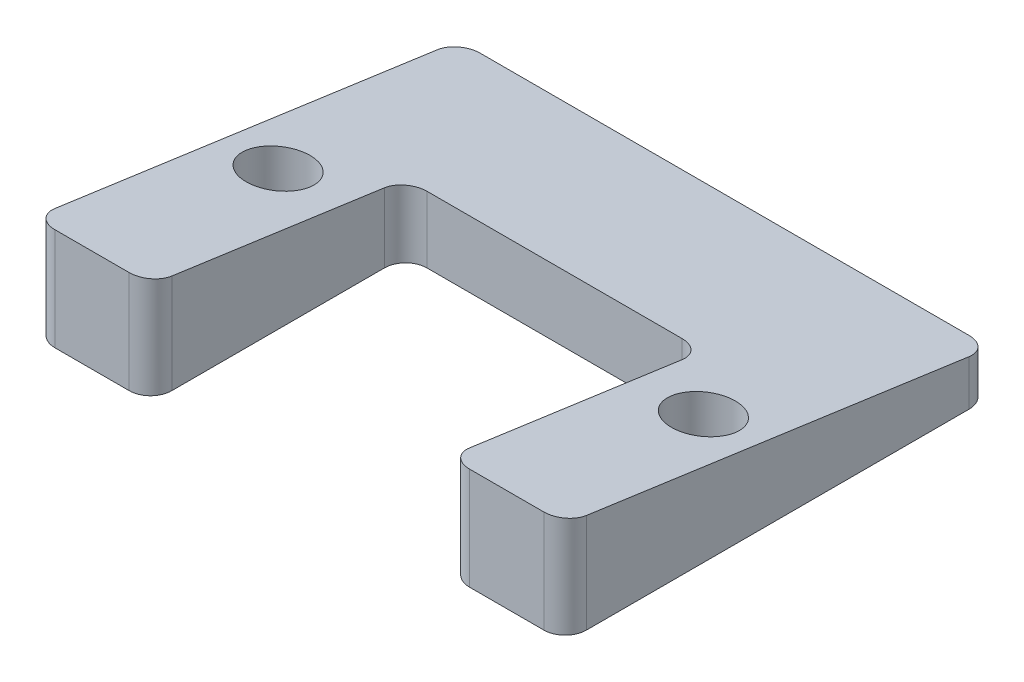
ISO-10303-21;
HEADER;
FILE_DESCRIPTION(('STEP AP214'),'2;1');
FILE_NAME('part.step','',(''),(''),'','','');
FILE_SCHEMA(('AUTOMOTIVE_DESIGN { 1 0 10303 214 1 1 1 1 }'));
ENDSEC;
DATA;
#1=APPLICATION_CONTEXT('core data for automotive mechanical design processes');
#2=APPLICATION_PROTOCOL_DEFINITION('international standard','automotive_design',2000,#1);
#3=PRODUCT_CONTEXT('',#1,'mechanical');
#4=PRODUCT('Part','Part','',(#3));
#5=PRODUCT_RELATED_PRODUCT_CATEGORY('part','',(#4));
#6=PRODUCT_DEFINITION_FORMATION('','',#4);
#7=PRODUCT_DEFINITION_CONTEXT('part definition',#1,'design');
#8=PRODUCT_DEFINITION('design','',#6,#7);
#9=PRODUCT_DEFINITION_SHAPE('','',#8);
#10=(LENGTH_UNIT() NAMED_UNIT(*) SI_UNIT(.MILLI.,.METRE.));
#11=(NAMED_UNIT(*) PLANE_ANGLE_UNIT() SI_UNIT($,.RADIAN.));
#12=(NAMED_UNIT(*) SI_UNIT($,.STERADIAN.) SOLID_ANGLE_UNIT());
#13=UNCERTAINTY_MEASURE_WITH_UNIT(LENGTH_MEASURE(1.E-05),#10,'distance_accuracy_value','');
#14=(GEOMETRIC_REPRESENTATION_CONTEXT(3) GLOBAL_UNCERTAINTY_ASSIGNED_CONTEXT((#13)) GLOBAL_UNIT_ASSIGNED_CONTEXT((#10,
#11,#12)) REPRESENTATION_CONTEXT('',''));
#15=CARTESIAN_POINT('',(0.,0.,0.));
#16=DIRECTION('',(0.,0.,1.));
#17=DIRECTION('',(1.,0.,0.));
#18=AXIS2_PLACEMENT_3D('',#15,#16,#17);
#19=CARTESIAN_POINT('',(0.,0.,0.));
#20=DIRECTION('',(0.,1.,0.));
#21=DIRECTION('',(0.,0.,1.));
#22=AXIS2_PLACEMENT_3D('',#19,#20,#21);
#23=PLANE('',#22);
#24=DIRECTION('',(-1.,0.,0.));
#25=VECTOR('',#24,1.);
#26=CARTESIAN_POINT('',(12.5,0.,-11.));
#27=LINE('',#26,#25);
#28=CARTESIAN_POINT('',(11.5,0.,-11.));
#29=VERTEX_POINT('',#28);
#30=CARTESIAN_POINT('',(-11.5,0.,-11.));
#31=VERTEX_POINT('',#30);
#32=EDGE_CURVE('E174',#29,#31,#27,.T.);
#33=ORIENTED_EDGE('',*,*,#32,.F.);
#34=CARTESIAN_POINT('',(11.5,0.,-10.));
#35=DIRECTION('',(0.,1.,0.));
#36=DIRECTION('',(0.,0.,1.));
#37=AXIS2_PLACEMENT_3D('',#34,#35,#36);
#38=CIRCLE('',#37,1.);
#39=CARTESIAN_POINT('',(12.5,0.,-10.));
#40=VERTEX_POINT('',#39);
#41=EDGE_CURVE('E245',#29,#40,#38,.F.);
#42=ORIENTED_EDGE('',*,*,#41,.T.);
#43=DIRECTION('',(0.,0.,-1.));
#44=VECTOR('',#43,1.);
#45=CARTESIAN_POINT('',(12.5,0.,9.));
#46=LINE('',#45,#44);
#47=CARTESIAN_POINT('',(12.5,0.,8.));
#48=VERTEX_POINT('',#47);
#49=EDGE_CURVE('E230',#48,#40,#46,.T.);
#50=ORIENTED_EDGE('',*,*,#49,.F.);
#51=CARTESIAN_POINT('',(11.5,0.,8.));
#52=DIRECTION('',(0.,1.,0.));
#53=DIRECTION('',(0.,0.,1.));
#54=AXIS2_PLACEMENT_3D('',#51,#52,#53);
#55=CIRCLE('',#54,1.);
#56=CARTESIAN_POINT('',(11.5,0.,9.));
#57=VERTEX_POINT('',#56);
#58=EDGE_CURVE('E243',#48,#57,#55,.F.);
#59=ORIENTED_EDGE('',*,*,#58,.T.);
#60=DIRECTION('',(1.,0.,0.));
#61=VECTOR('',#60,1.);
#62=CARTESIAN_POINT('',(7.,0.,9.));
#63=LINE('',#62,#61);
#64=CARTESIAN_POINT('',(8.,0.,9.));
#65=VERTEX_POINT('',#64);
#66=EDGE_CURVE('E227',#65,#57,#63,.T.);
#67=ORIENTED_EDGE('',*,*,#66,.F.);
#68=CARTESIAN_POINT('',(8.,0.,8.));
#69=DIRECTION('',(0.,1.,0.));
#70=DIRECTION('',(0.,0.,1.));
#71=AXIS2_PLACEMENT_3D('',#68,#69,#70);
#72=CIRCLE('',#71,1.);
#73=CARTESIAN_POINT('',(7.,0.,8.));
#74=VERTEX_POINT('',#73);
#75=EDGE_CURVE('E241',#65,#74,#72,.F.);
#76=ORIENTED_EDGE('',*,*,#75,.T.);
#77=DIRECTION('',(0.,0.,1.));
#78=VECTOR('',#77,1.);
#79=CARTESIAN_POINT('',(7.,0.,9.));
#80=LINE('',#79,#78);
#81=CARTESIAN_POINT('',(7.,0.,-2.));
#82=VERTEX_POINT('',#81);
#83=EDGE_CURVE('E225',#82,#74,#80,.T.);
#84=ORIENTED_EDGE('',*,*,#83,.F.);
#85=CARTESIAN_POINT('',(6.,0.,-2.));
#86=DIRECTION('',(0.,1.,0.));
#87=DIRECTION('',(0.,0.,1.));
#88=AXIS2_PLACEMENT_3D('',#85,#86,#87);
#89=CIRCLE('',#88,1.);
#90=CARTESIAN_POINT('',(6.,0.,-3.));
#91=VERTEX_POINT('',#90);
#92=EDGE_CURVE('E41',#82,#91,#89,.T.);
#93=ORIENTED_EDGE('',*,*,#92,.T.);
#94=DIRECTION('',(1.,0.,0.));
#95=VECTOR('',#94,1.);
#96=CARTESIAN_POINT('',(7.,0.,-3.));
#97=LINE('',#96,#95);
#98=CARTESIAN_POINT('',(-6.,0.,-3.));
#99=VERTEX_POINT('',#98);
#100=EDGE_CURVE('E234',#99,#91,#97,.T.);
#101=ORIENTED_EDGE('',*,*,#100,.F.);
#102=CARTESIAN_POINT('',(-6.,0.,-2.));
#103=DIRECTION('',(0.,-1.,0.));
#104=DIRECTION('',(0.,0.,1.));
#105=AXIS2_PLACEMENT_3D('',#102,#103,#104);
#106=CIRCLE('',#105,1.);
#107=CARTESIAN_POINT('',(-7.,0.,-2.));
#108=VERTEX_POINT('',#107);
#109=EDGE_CURVE('E209',#108,#99,#106,.T.);
#110=ORIENTED_EDGE('',*,*,#109,.F.);
#111=DIRECTION('',(0.,0.,1.));
#112=VECTOR('',#111,1.);
#113=CARTESIAN_POINT('',(-7.,0.,9.));
#114=LINE('',#113,#112);
#115=CARTESIAN_POINT('',(-7.,0.,8.));
#116=VERTEX_POINT('',#115);
#117=EDGE_CURVE('E316',#108,#116,#114,.T.);
#118=ORIENTED_EDGE('',*,*,#117,.T.);
#119=CARTESIAN_POINT('',(-8.,0.,8.));
#120=DIRECTION('',(0.,-1.,0.));
#121=DIRECTION('',(0.,0.,1.));
#122=AXIS2_PLACEMENT_3D('',#119,#120,#121);
#123=CIRCLE('',#122,1.);
#124=CARTESIAN_POINT('',(-8.,0.,9.));
#125=VERTEX_POINT('',#124);
#126=EDGE_CURVE('E175',#125,#116,#123,.F.);
#127=ORIENTED_EDGE('',*,*,#126,.F.);
#128=DIRECTION('',(-1.,0.,0.));
#129=VECTOR('',#128,1.);
#130=CARTESIAN_POINT('',(-7.,0.,9.));
#131=LINE('',#130,#129);
#132=CARTESIAN_POINT('',(-11.5,0.,9.));
#133=VERTEX_POINT('',#132);
#134=EDGE_CURVE('E182',#125,#133,#131,.T.);
#135=ORIENTED_EDGE('',*,*,#134,.T.);
#136=CARTESIAN_POINT('',(-11.5,0.,8.));
#137=DIRECTION('',(0.,-1.,0.));
#138=DIRECTION('',(0.,0.,1.));
#139=AXIS2_PLACEMENT_3D('',#136,#137,#138);
#140=CIRCLE('',#139,1.);
#141=CARTESIAN_POINT('',(-12.5,0.,8.));
#142=VERTEX_POINT('',#141);
#143=EDGE_CURVE('E179',#142,#133,#140,.F.);
#144=ORIENTED_EDGE('',*,*,#143,.F.);
#145=DIRECTION('',(0.,0.,-1.));
#146=VECTOR('',#145,1.);
#147=CARTESIAN_POINT('',(-12.5,0.,9.));
#148=LINE('',#147,#146);
#149=CARTESIAN_POINT('',(-12.5,0.,-10.));
#150=VERTEX_POINT('',#149);
#151=EDGE_CURVE('E176',#142,#150,#148,.T.);
#152=ORIENTED_EDGE('',*,*,#151,.T.);
#153=CARTESIAN_POINT('',(-11.5,0.,-10.));
#154=DIRECTION('',(0.,-1.,0.));
#155=DIRECTION('',(0.,0.,1.));
#156=AXIS2_PLACEMENT_3D('',#153,#154,#155);
#157=CIRCLE('',#156,1.);
#158=EDGE_CURVE('E189',#31,#150,#157,.F.);
#159=ORIENTED_EDGE('',*,*,#158,.F.);
#160=EDGE_LOOP('',(#33,#42,#50,#59,#67,#76,#84,#93,#101,#110,#118,#127,#135,#144,#152,#159));
#161=FACE_BOUND('',#160,.T.);
#162=CARTESIAN_POINT('',(10.,0.,0.));
#163=DIRECTION('',(0.,1.,0.));
#164=DIRECTION('',(0.,0.,1.));
#165=AXIS2_PLACEMENT_3D('',#162,#163,#164);
#166=CIRCLE('',#165,1.5);
#167=CARTESIAN_POINT('',(10.,0.,1.5));
#168=VERTEX_POINT('',#167);
#169=EDGE_CURVE('E222',#168,#168,#166,.T.);
#170=ORIENTED_EDGE('',*,*,#169,.T.);
#171=EDGE_LOOP('',(#170));
#172=FACE_BOUND('',#171,.T.);
#173=CARTESIAN_POINT('',(-10.,0.,0.));
#174=DIRECTION('',(0.,-1.,0.));
#175=DIRECTION('',(0.,0.,1.));
#176=AXIS2_PLACEMENT_3D('',#173,#174,#175);
#177=CIRCLE('',#176,1.5);
#178=CARTESIAN_POINT('',(-10.,0.,1.5));
#179=VERTEX_POINT('',#178);
#180=EDGE_CURVE('E313',#179,#179,#177,.T.);
#181=ORIENTED_EDGE('',*,*,#180,.F.);
#182=EDGE_LOOP('',(#181));
#183=FACE_BOUND('',#182,.T.);
#184=ADVANCED_FACE('F33',(#161,#172,#183),#23,.F.);
#185=CARTESIAN_POINT('',(7.,10.,9.));
#186=DIRECTION('',(1.,0.,0.));
#187=DIRECTION('',(0.,0.,-1.));
#188=AXIS2_PLACEMENT_3D('',#185,#186,#187);
#189=PLANE('',#188);
#190=ORIENTED_EDGE('',*,*,#83,.T.);
#191=DIRECTION('',(0.,-1.,0.));
#192=VECTOR('',#191,1.);
#193=CARTESIAN_POINT('',(7.,10.,8.));
#194=LINE('',#193,#192);
#195=CARTESIAN_POINT('',(7.,4.67027585934544,8.));
#196=VERTEX_POINT('',#195);
#197=EDGE_CURVE('E53',#74,#196,#194,.F.);
#198=ORIENTED_EDGE('',*,*,#197,.T.);
#199=DIRECTION('',(0.,-0.139173100960066,-0.99026806874157));
#200=VECTOR('',#199,1.);
#201=CARTESIAN_POINT('',(7.,4.91132677441672,9.71516638265119));
#202=LINE('',#201,#200);
#203=CARTESIAN_POINT('',(7.,3.26486751232152,-2.));
#204=VERTEX_POINT('',#203);
#205=EDGE_CURVE('E220',#196,#204,#202,.T.);
#206=ORIENTED_EDGE('',*,*,#205,.T.);
#207=DIRECTION('',(0.,-1.,0.));
#208=VECTOR('',#207,1.);
#209=CARTESIAN_POINT('',(7.,0.,-2.));
#210=LINE('',#209,#208);
#211=EDGE_CURVE('E262',#204,#82,#210,.T.);
#212=ORIENTED_EDGE('',*,*,#211,.T.);
#213=EDGE_LOOP('',(#190,#198,#206,#212));
#214=FACE_BOUND('',#213,.T.);
#215=ADVANCED_FACE('F277',(#214),#189,.F.);
#216=CARTESIAN_POINT('',(7.,10.,9.));
#217=DIRECTION('',(0.,0.,-1.));
#218=DIRECTION('',(-1.,0.,0.));
#219=AXIS2_PLACEMENT_3D('',#216,#217,#218);
#220=PLANE('',#219);
#221=ORIENTED_EDGE('',*,*,#66,.T.);
#222=DIRECTION('',(0.,-1.,0.));
#223=VECTOR('',#222,1.);
#224=CARTESIAN_POINT('',(11.5,10.,9.));
#225=LINE('',#224,#223);
#226=CARTESIAN_POINT('',(11.5,4.81081669404783,9.));
#227=VERTEX_POINT('',#226);
#228=EDGE_CURVE('E260',#57,#227,#225,.F.);
#229=ORIENTED_EDGE('',*,*,#228,.T.);
#230=DIRECTION('',(1.,0.,0.));
#231=VECTOR('',#230,1.);
#232=CARTESIAN_POINT('',(0.,4.81081669404783,9.));
#233=LINE('',#232,#231);
#234=CARTESIAN_POINT('',(8.,4.81081669404783,9.));
#235=VERTEX_POINT('',#234);
#236=EDGE_CURVE('E159',#235,#227,#233,.T.);
#237=ORIENTED_EDGE('',*,*,#236,.F.);
#238=DIRECTION('',(0.,-1.,0.));
#239=VECTOR('',#238,1.);
#240=CARTESIAN_POINT('',(8.,10.,9.));
#241=LINE('',#240,#239);
#242=EDGE_CURVE('E257',#235,#65,#241,.T.);
#243=ORIENTED_EDGE('',*,*,#242,.T.);
#244=EDGE_LOOP('',(#221,#229,#237,#243));
#245=FACE_BOUND('',#244,.T.);
#246=ADVANCED_FACE('F285',(#245),#220,.F.);
#247=CARTESIAN_POINT('',(12.5,10.,9.));
#248=DIRECTION('',(-1.,0.,0.));
#249=DIRECTION('',(0.,0.,1.));
#250=AXIS2_PLACEMENT_3D('',#247,#248,#249);
#251=PLANE('',#250);
#252=ORIENTED_EDGE('',*,*,#49,.T.);
#253=DIRECTION('',(0.,-1.,0.));
#254=VECTOR('',#253,1.);
#255=CARTESIAN_POINT('',(12.5,10.,-10.));
#256=LINE('',#255,#254);
#257=CARTESIAN_POINT('',(12.5,2.14054083470239,-10.));
#258=VERTEX_POINT('',#257);
#259=EDGE_CURVE('E250',#40,#258,#256,.F.);
#260=ORIENTED_EDGE('',*,*,#259,.T.);
#261=DIRECTION('',(0.,-0.139173100960066,-0.99026806874157));
#262=VECTOR('',#261,1.);
#263=CARTESIAN_POINT('',(12.5,4.81081669404783,9.));
#264=LINE('',#263,#262);
#265=CARTESIAN_POINT('',(12.5,4.67027585934544,8.));
#266=VERTEX_POINT('',#265);
#267=EDGE_CURVE('E214',#266,#258,#264,.T.);
#268=ORIENTED_EDGE('',*,*,#267,.F.);
#269=DIRECTION('',(0.,-1.,0.));
#270=VECTOR('',#269,1.);
#271=CARTESIAN_POINT('',(12.5,10.,8.));
#272=LINE('',#271,#270);
#273=EDGE_CURVE('E247',#266,#48,#272,.T.);
#274=ORIENTED_EDGE('',*,*,#273,.T.);
#275=EDGE_LOOP('',(#252,#260,#268,#274));
#276=FACE_BOUND('',#275,.T.);
#277=ADVANCED_FACE('F294',(#276),#251,.F.);
#278=CARTESIAN_POINT('',(12.5,10.,-11.));
#279=DIRECTION('',(0.,0.,1.));
#280=DIRECTION('',(1.,0.,0.));
#281=AXIS2_PLACEMENT_3D('',#278,#279,#280);
#282=PLANE('',#281);
#283=DIRECTION('',(1.,0.,0.));
#284=VECTOR('',#283,1.);
#285=CARTESIAN_POINT('',(0.,2.,-11.));
#286=LINE('',#285,#284);
#287=CARTESIAN_POINT('',(-11.5,2.,-11.));
#288=VERTEX_POINT('',#287);
#289=CARTESIAN_POINT('',(11.5,2.,-11.));
#290=VERTEX_POINT('',#289);
#291=EDGE_CURVE('E144',#288,#290,#286,.T.);
#292=ORIENTED_EDGE('',*,*,#291,.T.);
#293=DIRECTION('',(0.,-1.,0.));
#294=VECTOR('',#293,1.);
#295=CARTESIAN_POINT('',(11.5,10.,-11.));
#296=LINE('',#295,#294);
#297=EDGE_CURVE('E237',#290,#29,#296,.T.);
#298=ORIENTED_EDGE('',*,*,#297,.T.);
#299=ORIENTED_EDGE('',*,*,#32,.T.);
#300=DIRECTION('',(0.,-1.,0.));
#301=VECTOR('',#300,1.);
#302=CARTESIAN_POINT('',(-11.5,10.,-11.));
#303=LINE('',#302,#301);
#304=EDGE_CURVE('E165',#288,#31,#303,.T.);
#305=ORIENTED_EDGE('',*,*,#304,.F.);
#306=EDGE_LOOP('',(#292,#298,#299,#305));
#307=FACE_BOUND('',#306,.T.);
#308=ADVANCED_FACE('F172',(#307),#282,.F.);
#309=CARTESIAN_POINT('',(7.,10.,-3.));
#310=DIRECTION('',(0.,0.,-1.));
#311=DIRECTION('',(-1.,0.,0.));
#312=AXIS2_PLACEMENT_3D('',#309,#310,#311);
#313=PLANE('',#312);
#314=ORIENTED_EDGE('',*,*,#100,.T.);
#315=DIRECTION('',(0.,-1.,0.));
#316=VECTOR('',#315,1.);
#317=CARTESIAN_POINT('',(6.,3.12432667761913,-3.));
#318=LINE('',#317,#316);
#319=CARTESIAN_POINT('',(6.,3.12432667761913,-3.));
#320=VERTEX_POINT('',#319);
#321=EDGE_CURVE('E266',#91,#320,#318,.F.);
#322=ORIENTED_EDGE('',*,*,#321,.T.);
#323=DIRECTION('',(-1.,0.,0.));
#324=VECTOR('',#323,1.);
#325=CARTESIAN_POINT('',(7.,3.12432667761913,-3.));
#326=LINE('',#325,#324);
#327=CARTESIAN_POINT('',(-6.,3.12432667761913,-3.));
#328=VERTEX_POINT('',#327);
#329=EDGE_CURVE('E218',#320,#328,#326,.T.);
#330=ORIENTED_EDGE('',*,*,#329,.T.);
#331=DIRECTION('',(0.,-1.,0.));
#332=VECTOR('',#331,1.);
#333=CARTESIAN_POINT('',(-6.,3.12432667761913,-3.));
#334=LINE('',#333,#332);
#335=EDGE_CURVE('E206',#99,#328,#334,.F.);
#336=ORIENTED_EDGE('',*,*,#335,.F.);
#337=EDGE_LOOP('',(#314,#322,#330,#336));
#338=FACE_BOUND('',#337,.T.);
#339=ADVANCED_FACE('F276',(#338),#313,.F.);
#340=CARTESIAN_POINT('',(10.,10.,0.));
#341=DIRECTION('',(0.,-1.,0.));
#342=DIRECTION('',(0.,0.,-1.));
#343=AXIS2_PLACEMENT_3D('',#340,#341,#342);
#344=CYLINDRICAL_SURFACE('',#343,1.5);
#345=CARTESIAN_POINT('',(10.,3.54594918172631,0.));
#346=DIRECTION('',(0.,-0.99026806874157,0.139173100960066));
#347=DIRECTION('',(0.,-0.139173100960066,-0.99026806874157));
#348=AXIS2_PLACEMENT_3D('',#345,#346,#347);
#349=ELLIPSE('',#348,1.51474135877793,1.5);
#350=CARTESIAN_POINT('',(10.,3.33513792967272,-1.5));
#351=VERTEX_POINT('',#350);
#352=EDGE_CURVE('E158',#351,#351,#349,.T.);
#353=ORIENTED_EDGE('',*,*,#352,.F.);
#354=EDGE_LOOP('',(#353));
#355=FACE_BOUND('',#354,.T.);
#356=ORIENTED_EDGE('',*,*,#169,.F.);
#357=EDGE_LOOP('',(#356));
#358=FACE_BOUND('',#357,.T.);
#359=ADVANCED_FACE('F352',(#355,#358),#344,.F.);
#360=CARTESIAN_POINT('',(0.,4.81081669404783,9.));
#361=DIRECTION('',(0.,-0.99026806874157,0.139173100960066));
#362=DIRECTION('',(0.,-0.139173100960066,-0.99026806874157));
#363=AXIS2_PLACEMENT_3D('',#360,#361,#362);
#364=PLANE('',#363);
#365=ORIENTED_EDGE('',*,*,#352,.T.);
#366=EDGE_LOOP('',(#365));
#367=FACE_BOUND('',#366,.T.);
#368=ORIENTED_EDGE('',*,*,#267,.T.);
#369=CARTESIAN_POINT('',(11.5,2.14054083470239,-10.));
#370=DIRECTION('',(0.,-0.99026806874157,0.139173100960066));
#371=DIRECTION('',(0.,-0.139173100960066,-0.99026806874157));
#372=AXIS2_PLACEMENT_3D('',#369,#370,#371);
#373=ELLIPSE('',#372,1.00982757251862,1.);
#374=EDGE_CURVE('E153',#258,#290,#373,.F.);
#375=ORIENTED_EDGE('',*,*,#374,.T.);
#376=ORIENTED_EDGE('',*,*,#291,.F.);
#377=CARTESIAN_POINT('',(-11.5,2.14054083470239,-10.));
#378=DIRECTION('',(0.,0.99026806874157,-0.139173100960066));
#379=DIRECTION('',(0.,-0.139173100960066,-0.99026806874157));
#380=AXIS2_PLACEMENT_3D('',#377,#378,#379);
#381=ELLIPSE('',#380,1.00982757251862,1.);
#382=CARTESIAN_POINT('',(-12.5,2.14054083470239,-10.));
#383=VERTEX_POINT('',#382);
#384=EDGE_CURVE('E150',#383,#288,#381,.F.);
#385=ORIENTED_EDGE('',*,*,#384,.F.);
#386=DIRECTION('',(0.,-0.139173100960066,-0.99026806874157));
#387=VECTOR('',#386,1.);
#388=CARTESIAN_POINT('',(-12.5,4.81081669404783,9.));
#389=LINE('',#388,#387);
#390=CARTESIAN_POINT('',(-12.5,4.67027585934544,8.));
#391=VERTEX_POINT('',#390);
#392=EDGE_CURVE('E304',#391,#383,#389,.T.);
#393=ORIENTED_EDGE('',*,*,#392,.F.);
#394=CARTESIAN_POINT('',(-11.5,4.67027585934544,8.));
#395=DIRECTION('',(0.,0.99026806874157,-0.139173100960066));
#396=DIRECTION('',(0.,-0.139173100960066,-0.99026806874157));
#397=AXIS2_PLACEMENT_3D('',#394,#395,#396);
#398=ELLIPSE('',#397,1.00982757251862,1.);
#399=CARTESIAN_POINT('',(-11.5,4.81081669404783,9.));
#400=VERTEX_POINT('',#399);
#401=EDGE_CURVE('E170',#400,#391,#398,.F.);
#402=ORIENTED_EDGE('',*,*,#401,.F.);
#403=DIRECTION('',(-1.,0.,0.));
#404=VECTOR('',#403,1.);
#405=CARTESIAN_POINT('',(0.,4.81081669404783,9.));
#406=LINE('',#405,#404);
#407=CARTESIAN_POINT('',(-8.,4.81081669404783,9.));
#408=VERTEX_POINT('',#407);
#409=EDGE_CURVE('E305',#408,#400,#406,.T.);
#410=ORIENTED_EDGE('',*,*,#409,.F.);
#411=CARTESIAN_POINT('',(-8.,4.67027585934544,8.));
#412=DIRECTION('',(0.,0.99026806874157,-0.139173100960066));
#413=DIRECTION('',(0.,-0.139173100960066,-0.99026806874157));
#414=AXIS2_PLACEMENT_3D('',#411,#412,#413);
#415=ELLIPSE('',#414,1.00982757251862,1.);
#416=CARTESIAN_POINT('',(-7.,4.67027585934544,8.));
#417=VERTEX_POINT('',#416);
#418=EDGE_CURVE('E194',#417,#408,#415,.F.);
#419=ORIENTED_EDGE('',*,*,#418,.F.);
#420=DIRECTION('',(0.,-0.139173100960066,-0.99026806874157));
#421=VECTOR('',#420,1.);
#422=CARTESIAN_POINT('',(-7.,4.91132677441672,9.71516638265119));
#423=LINE('',#422,#421);
#424=CARTESIAN_POINT('',(-7.,3.26486751232152,-2.));
#425=VERTEX_POINT('',#424);
#426=EDGE_CURVE('E310',#417,#425,#423,.T.);
#427=ORIENTED_EDGE('',*,*,#426,.T.);
#428=CARTESIAN_POINT('',(-6.,3.26486751232153,-2.));
#429=DIRECTION('',(0.,0.99026806874157,-0.139173100960066));
#430=DIRECTION('',(0.,0.139173100960066,0.99026806874157));
#431=AXIS2_PLACEMENT_3D('',#428,#429,#430);
#432=ELLIPSE('',#431,1.00982757251862,1.);
#433=EDGE_CURVE('E212',#328,#425,#432,.T.);
#434=ORIENTED_EDGE('',*,*,#433,.F.);
#435=ORIENTED_EDGE('',*,*,#329,.F.);
#436=CARTESIAN_POINT('',(6.,3.26486751232153,-2.));
#437=DIRECTION('',(0.,-0.99026806874157,0.139173100960066));
#438=DIRECTION('',(0.,0.139173100960066,0.99026806874157));
#439=AXIS2_PLACEMENT_3D('',#436,#437,#438);
#440=ELLIPSE('',#439,1.00982757251862,1.);
#441=EDGE_CURVE('E11',#320,#204,#440,.T.);
#442=ORIENTED_EDGE('',*,*,#441,.T.);
#443=ORIENTED_EDGE('',*,*,#205,.F.);
#444=CARTESIAN_POINT('',(8.,4.67027585934544,8.));
#445=DIRECTION('',(0.,-0.99026806874157,0.139173100960066));
#446=DIRECTION('',(0.,-0.139173100960066,-0.99026806874157));
#447=AXIS2_PLACEMENT_3D('',#444,#445,#446);
#448=ELLIPSE('',#447,1.00982757251862,1.);
#449=EDGE_CURVE('E252',#196,#235,#448,.F.);
#450=ORIENTED_EDGE('',*,*,#449,.T.);
#451=ORIENTED_EDGE('',*,*,#236,.T.);
#452=CARTESIAN_POINT('',(11.5,4.67027585934544,8.));
#453=DIRECTION('',(0.,-0.99026806874157,0.139173100960066));
#454=DIRECTION('',(0.,-0.139173100960066,-0.99026806874157));
#455=AXIS2_PLACEMENT_3D('',#452,#453,#454);
#456=ELLIPSE('',#455,1.00982757251862,1.);
#457=EDGE_CURVE('E254',#227,#266,#456,.F.);
#458=ORIENTED_EDGE('',*,*,#457,.T.);
#459=EDGE_LOOP('',(#368,#375,#376,#385,#393,#402,#410,#419,#427,#434,#435,#442,#443,#450,#451,#458));
#460=FACE_BOUND('',#459,.T.);
#461=CARTESIAN_POINT('',(-10.,3.54594918172631,0.));
#462=DIRECTION('',(0.,0.99026806874157,-0.139173100960066));
#463=DIRECTION('',(0.,-0.139173100960066,-0.99026806874157));
#464=AXIS2_PLACEMENT_3D('',#461,#462,#463);
#465=ELLIPSE('',#464,1.51474135877793,1.5);
#466=CARTESIAN_POINT('',(-10.,3.33513792967272,-1.5));
#467=VERTEX_POINT('',#466);
#468=EDGE_CURVE('E185',#467,#467,#465,.T.);
#469=ORIENTED_EDGE('',*,*,#468,.F.);
#470=EDGE_LOOP('',(#469));
#471=FACE_BOUND('',#470,.T.);
#472=ADVANCED_FACE('F147',(#367,#460,#471),#364,.F.);
#473=CARTESIAN_POINT('',(11.5,10.,-10.));
#474=DIRECTION('',(0.,-1.,0.));
#475=DIRECTION('',(0.,0.,-1.));
#476=AXIS2_PLACEMENT_3D('',#473,#474,#475);
#477=CYLINDRICAL_SURFACE('',#476,1.);
#478=ORIENTED_EDGE('',*,*,#374,.F.);
#479=ORIENTED_EDGE('',*,*,#259,.F.);
#480=ORIENTED_EDGE('',*,*,#41,.F.);
#481=ORIENTED_EDGE('',*,*,#297,.F.);
#482=EDGE_LOOP('',(#478,#479,#480,#481));
#483=FACE_BOUND('',#482,.T.);
#484=ADVANCED_FACE('F297',(#483),#477,.T.);
#485=CARTESIAN_POINT('',(11.5,10.,8.));
#486=DIRECTION('',(0.,-1.,0.));
#487=DIRECTION('',(0.,0.,-1.));
#488=AXIS2_PLACEMENT_3D('',#485,#486,#487);
#489=CYLINDRICAL_SURFACE('',#488,1.);
#490=ORIENTED_EDGE('',*,*,#457,.F.);
#491=ORIENTED_EDGE('',*,*,#228,.F.);
#492=ORIENTED_EDGE('',*,*,#58,.F.);
#493=ORIENTED_EDGE('',*,*,#273,.F.);
#494=EDGE_LOOP('',(#490,#491,#492,#493));
#495=FACE_BOUND('',#494,.T.);
#496=ADVANCED_FACE('F291',(#495),#489,.T.);
#497=CARTESIAN_POINT('',(8.,10.,8.));
#498=DIRECTION('',(0.,-1.,0.));
#499=DIRECTION('',(0.,0.,-1.));
#500=AXIS2_PLACEMENT_3D('',#497,#498,#499);
#501=CYLINDRICAL_SURFACE('',#500,1.);
#502=ORIENTED_EDGE('',*,*,#449,.F.);
#503=ORIENTED_EDGE('',*,*,#197,.F.);
#504=ORIENTED_EDGE('',*,*,#75,.F.);
#505=ORIENTED_EDGE('',*,*,#242,.F.);
#506=EDGE_LOOP('',(#502,#503,#504,#505));
#507=FACE_BOUND('',#506,.T.);
#508=ADVANCED_FACE('F282',(#507),#501,.T.);
#509=CARTESIAN_POINT('',(6.,10.,-2.));
#510=DIRECTION('',(0.,1.,0.));
#511=DIRECTION('',(0.,0.,1.));
#512=AXIS2_PLACEMENT_3D('',#509,#510,#511);
#513=CYLINDRICAL_SURFACE('',#512,1.);
#514=ORIENTED_EDGE('',*,*,#441,.F.);
#515=ORIENTED_EDGE('',*,*,#321,.F.);
#516=ORIENTED_EDGE('',*,*,#92,.F.);
#517=ORIENTED_EDGE('',*,*,#211,.F.);
#518=EDGE_LOOP('',(#514,#515,#516,#517));
#519=FACE_BOUND('',#518,.T.);
#520=ADVANCED_FACE('F35',(#519),#513,.F.);
#521=CARTESIAN_POINT('',(-7.,10.,9.));
#522=DIRECTION('',(-1.,0.,0.));
#523=DIRECTION('',(0.,0.,-1.));
#524=AXIS2_PLACEMENT_3D('',#521,#522,#523);
#525=PLANE('',#524);
#526=ORIENTED_EDGE('',*,*,#117,.F.);
#527=DIRECTION('',(0.,-1.,0.));
#528=VECTOR('',#527,1.);
#529=CARTESIAN_POINT('',(-7.,0.,-2.));
#530=LINE('',#529,#528);
#531=EDGE_CURVE('E201',#425,#108,#530,.T.);
#532=ORIENTED_EDGE('',*,*,#531,.F.);
#533=ORIENTED_EDGE('',*,*,#426,.F.);
#534=DIRECTION('',(0.,-1.,0.));
#535=VECTOR('',#534,1.);
#536=CARTESIAN_POINT('',(-7.,10.,8.));
#537=LINE('',#536,#535);
#538=EDGE_CURVE('E203',#116,#417,#537,.F.);
#539=ORIENTED_EDGE('',*,*,#538,.F.);
#540=EDGE_LOOP('',(#526,#532,#533,#539));
#541=FACE_BOUND('',#540,.T.);
#542=ADVANCED_FACE('F334',(#541),#525,.F.);
#543=CARTESIAN_POINT('',(-7.,10.,9.));
#544=DIRECTION('',(0.,0.,-1.));
#545=DIRECTION('',(1.,0.,0.));
#546=AXIS2_PLACEMENT_3D('',#543,#544,#545);
#547=PLANE('',#546);
#548=ORIENTED_EDGE('',*,*,#134,.F.);
#549=DIRECTION('',(0.,-1.,0.));
#550=VECTOR('',#549,1.);
#551=CARTESIAN_POINT('',(-8.,10.,9.));
#552=LINE('',#551,#550);
#553=EDGE_CURVE('E169',#408,#125,#552,.T.);
#554=ORIENTED_EDGE('',*,*,#553,.F.);
#555=ORIENTED_EDGE('',*,*,#409,.T.);
#556=DIRECTION('',(0.,-1.,0.));
#557=VECTOR('',#556,1.);
#558=CARTESIAN_POINT('',(-11.5,10.,9.));
#559=LINE('',#558,#557);
#560=EDGE_CURVE('E198',#133,#400,#559,.F.);
#561=ORIENTED_EDGE('',*,*,#560,.F.);
#562=EDGE_LOOP('',(#548,#554,#555,#561));
#563=FACE_BOUND('',#562,.T.);
#564=ADVANCED_FACE('F323',(#563),#547,.F.);
#565=CARTESIAN_POINT('',(-12.5,10.,9.));
#566=DIRECTION('',(1.,0.,0.));
#567=DIRECTION('',(0.,0.,1.));
#568=AXIS2_PLACEMENT_3D('',#565,#566,#567);
#569=PLANE('',#568);
#570=ORIENTED_EDGE('',*,*,#151,.F.);
#571=DIRECTION('',(0.,-1.,0.));
#572=VECTOR('',#571,1.);
#573=CARTESIAN_POINT('',(-12.5,10.,8.));
#574=LINE('',#573,#572);
#575=EDGE_CURVE('E191',#391,#142,#574,.T.);
#576=ORIENTED_EDGE('',*,*,#575,.F.);
#577=ORIENTED_EDGE('',*,*,#392,.T.);
#578=DIRECTION('',(0.,-1.,0.));
#579=VECTOR('',#578,1.);
#580=CARTESIAN_POINT('',(-12.5,10.,-10.));
#581=LINE('',#580,#579);
#582=EDGE_CURVE('E167',#150,#383,#581,.F.);
#583=ORIENTED_EDGE('',*,*,#582,.F.);
#584=EDGE_LOOP('',(#570,#576,#577,#583));
#585=FACE_BOUND('',#584,.T.);
#586=ADVANCED_FACE('F303',(#585),#569,.F.);
#587=CARTESIAN_POINT('',(-10.,10.,0.));
#588=DIRECTION('',(0.,-1.,0.));
#589=DIRECTION('',(0.,0.,-1.));
#590=AXIS2_PLACEMENT_3D('',#587,#588,#589);
#591=CYLINDRICAL_SURFACE('',#590,1.5);
#592=ORIENTED_EDGE('',*,*,#468,.T.);
#593=EDGE_LOOP('',(#592));
#594=FACE_BOUND('',#593,.T.);
#595=ORIENTED_EDGE('',*,*,#180,.T.);
#596=EDGE_LOOP('',(#595));
#597=FACE_BOUND('',#596,.T.);
#598=ADVANCED_FACE('F380',(#594,#597),#591,.F.);
#599=CARTESIAN_POINT('',(-11.5,10.,-10.));
#600=DIRECTION('',(0.,-1.,0.));
#601=DIRECTION('',(0.,0.,-1.));
#602=AXIS2_PLACEMENT_3D('',#599,#600,#601);
#603=CYLINDRICAL_SURFACE('',#602,1.);
#604=ORIENTED_EDGE('',*,*,#384,.T.);
#605=ORIENTED_EDGE('',*,*,#304,.T.);
#606=ORIENTED_EDGE('',*,*,#158,.T.);
#607=ORIENTED_EDGE('',*,*,#582,.T.);
#608=EDGE_LOOP('',(#604,#605,#606,#607));
#609=FACE_BOUND('',#608,.T.);
#610=ADVANCED_FACE('F163',(#609),#603,.T.);
#611=CARTESIAN_POINT('',(-11.5,10.,8.));
#612=DIRECTION('',(0.,-1.,0.));
#613=DIRECTION('',(0.,0.,-1.));
#614=AXIS2_PLACEMENT_3D('',#611,#612,#613);
#615=CYLINDRICAL_SURFACE('',#614,1.);
#616=ORIENTED_EDGE('',*,*,#401,.T.);
#617=ORIENTED_EDGE('',*,*,#575,.T.);
#618=ORIENTED_EDGE('',*,*,#143,.T.);
#619=ORIENTED_EDGE('',*,*,#560,.T.);
#620=EDGE_LOOP('',(#616,#617,#618,#619));
#621=FACE_BOUND('',#620,.T.);
#622=ADVANCED_FACE('F326',(#621),#615,.T.);
#623=CARTESIAN_POINT('',(-8.,10.,8.));
#624=DIRECTION('',(0.,-1.,0.));
#625=DIRECTION('',(0.,0.,-1.));
#626=AXIS2_PLACEMENT_3D('',#623,#624,#625);
#627=CYLINDRICAL_SURFACE('',#626,1.);
#628=ORIENTED_EDGE('',*,*,#418,.T.);
#629=ORIENTED_EDGE('',*,*,#553,.T.);
#630=ORIENTED_EDGE('',*,*,#126,.T.);
#631=ORIENTED_EDGE('',*,*,#538,.T.);
#632=EDGE_LOOP('',(#628,#629,#630,#631));
#633=FACE_BOUND('',#632,.T.);
#634=ADVANCED_FACE('F331',(#633),#627,.T.);
#635=CARTESIAN_POINT('',(-6.,10.,-2.));
#636=DIRECTION('',(0.,1.,0.));
#637=DIRECTION('',(0.,0.,1.));
#638=AXIS2_PLACEMENT_3D('',#635,#636,#637);
#639=CYLINDRICAL_SURFACE('',#638,1.);
#640=ORIENTED_EDGE('',*,*,#433,.T.);
#641=ORIENTED_EDGE('',*,*,#531,.T.);
#642=ORIENTED_EDGE('',*,*,#109,.T.);
#643=ORIENTED_EDGE('',*,*,#335,.T.);
#644=EDGE_LOOP('',(#640,#641,#642,#643));
#645=FACE_BOUND('',#644,.T.);
#646=ADVANCED_FACE('F336',(#645),#639,.F.);
#647=CLOSED_SHELL('',(#184,#215,#246,#277,#308,#339,#359,#472,#484,#496,#508,#520,#542,#564,
#586,#598,#610,#622,#634,#646));
#648=MANIFOLD_SOLID_BREP('B2',#647);
#649=ADVANCED_BREP_SHAPE_REPRESENTATION('',(#18,#648),#14);
#650=SHAPE_DEFINITION_REPRESENTATION(#9,#649);
ENDSEC;
END-ISO-10303-21;
